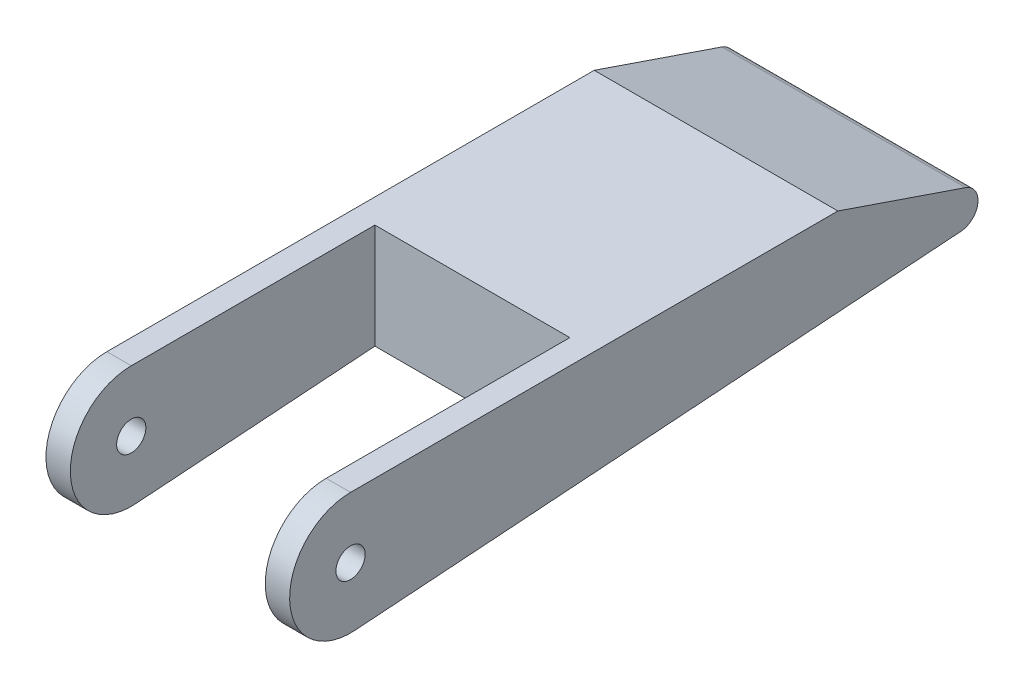
ISO-10303-21;
HEADER;
FILE_DESCRIPTION(('STEP AP214'),'2;1');
FILE_NAME('part.step','',(''),(''),'','','');
FILE_SCHEMA(('AUTOMOTIVE_DESIGN { 1 0 10303 214 1 1 1 1 }'));
ENDSEC;
DATA;
#1=APPLICATION_CONTEXT('core data for automotive mechanical design processes');
#2=APPLICATION_PROTOCOL_DEFINITION('international standard','automotive_design',2000,#1);
#3=PRODUCT_CONTEXT('',#1,'mechanical');
#4=PRODUCT('Part','Part','',(#3));
#5=PRODUCT_RELATED_PRODUCT_CATEGORY('part','',(#4));
#6=PRODUCT_DEFINITION_FORMATION('','',#4);
#7=PRODUCT_DEFINITION_CONTEXT('part definition',#1,'design');
#8=PRODUCT_DEFINITION('design','',#6,#7);
#9=PRODUCT_DEFINITION_SHAPE('','',#8);
#10=(LENGTH_UNIT() NAMED_UNIT(*) SI_UNIT(.MILLI.,.METRE.));
#11=(NAMED_UNIT(*) PLANE_ANGLE_UNIT() SI_UNIT($,.RADIAN.));
#12=(NAMED_UNIT(*) SI_UNIT($,.STERADIAN.) SOLID_ANGLE_UNIT());
#13=UNCERTAINTY_MEASURE_WITH_UNIT(LENGTH_MEASURE(1.E-05),#10,'distance_accuracy_value','');
#14=(GEOMETRIC_REPRESENTATION_CONTEXT(3) GLOBAL_UNCERTAINTY_ASSIGNED_CONTEXT((#13)) GLOBAL_UNIT_ASSIGNED_CONTEXT((#10,
#11,#12)) REPRESENTATION_CONTEXT('',''));
#15=CARTESIAN_POINT('',(0.,0.,0.));
#16=DIRECTION('',(0.,0.,1.));
#17=DIRECTION('',(1.,0.,0.));
#18=AXIS2_PLACEMENT_3D('',#15,#16,#17);
#19=CARTESIAN_POINT('',(20.,0.,0.));
#20=DIRECTION('',(-1.,0.,0.));
#21=DIRECTION('',(0.,0.,1.));
#22=AXIS2_PLACEMENT_3D('',#19,#20,#21);
#23=CYLINDRICAL_SURFACE('',#22,10.);
#24=DIRECTION('',(-1.,0.,0.));
#25=VECTOR('',#24,1.);
#26=CARTESIAN_POINT('',(20.,-9.97546991374341,-0.7));
#27=LINE('',#26,#25);
#28=CARTESIAN_POINT('',(-16.,-9.97546991374341,-0.700000000000006));
#29=VERTEX_POINT('',#28);
#30=CARTESIAN_POINT('',(-20.,-9.97546991374341,-0.7));
#31=VERTEX_POINT('',#30);
#32=EDGE_CURVE('E662',#29,#31,#27,.T.);
#33=ORIENTED_EDGE('',*,*,#32,.F.);
#34=CARTESIAN_POINT('',(-16.,0.,0.));
#35=DIRECTION('',(-1.,0.,0.));
#36=DIRECTION('',(0.,0.,1.));
#37=AXIS2_PLACEMENT_3D('',#34,#35,#36);
#38=CIRCLE('',#37,10.);
#39=CARTESIAN_POINT('',(-16.,10.,0.));
#40=VERTEX_POINT('',#39);
#41=EDGE_CURVE('E764',#29,#40,#38,.T.);
#42=ORIENTED_EDGE('',*,*,#41,.T.);
#43=DIRECTION('',(-1.,0.,0.));
#44=VECTOR('',#43,1.);
#45=CARTESIAN_POINT('',(20.,10.,0.));
#46=LINE('',#45,#44);
#47=CARTESIAN_POINT('',(-20.,10.,0.));
#48=VERTEX_POINT('',#47);
#49=EDGE_CURVE('E703',#40,#48,#46,.T.);
#50=ORIENTED_EDGE('',*,*,#49,.T.);
#51=CARTESIAN_POINT('',(-20.,0.,0.));
#52=DIRECTION('',(1.,0.,0.));
#53=DIRECTION('',(0.,0.,-1.));
#54=AXIS2_PLACEMENT_3D('',#51,#52,#53);
#55=CIRCLE('',#54,10.);
#56=EDGE_CURVE('E745',#48,#31,#55,.T.);
#57=ORIENTED_EDGE('',*,*,#56,.T.);
#58=EDGE_LOOP('',(#33,#42,#50,#57));
#59=FACE_BOUND('',#58,.T.);
#60=ADVANCED_FACE('F655',(#59),#23,.T.);
#61=CARTESIAN_POINT('',(20.,10.,0.));
#62=DIRECTION('',(0.,-1.,0.));
#63=DIRECTION('',(0.,0.,-1.));
#64=AXIS2_PLACEMENT_3D('',#61,#62,#63);
#65=PLANE('',#64);
#66=DIRECTION('',(0.,0.,-1.));
#67=VECTOR('',#66,1.);
#68=CARTESIAN_POINT('',(16.,10.,-40.));
#69=LINE('',#68,#67);
#70=CARTESIAN_POINT('',(16.,10.,0.));
#71=VERTEX_POINT('',#70);
#72=CARTESIAN_POINT('',(16.,10.,-40.));
#73=VERTEX_POINT('',#72);
#74=EDGE_CURVE('E830',#71,#73,#69,.T.);
#75=ORIENTED_EDGE('',*,*,#74,.F.);
#76=CARTESIAN_POINT('',(20.,10.,0.));
#77=VERTEX_POINT('',#76);
#78=EDGE_CURVE('E754',#77,#71,#46,.T.);
#79=ORIENTED_EDGE('',*,*,#78,.F.);
#80=DIRECTION('',(0.,0.,1.));
#81=VECTOR('',#80,1.);
#82=CARTESIAN_POINT('',(20.,10.,0.));
#83=LINE('',#82,#81);
#84=CARTESIAN_POINT('',(20.,10.,-80.));
#85=VERTEX_POINT('',#84);
#86=EDGE_CURVE('E676',#85,#77,#83,.T.);
#87=ORIENTED_EDGE('',*,*,#86,.F.);
#88=DIRECTION('',(-1.,0.,0.));
#89=VECTOR('',#88,1.);
#90=CARTESIAN_POINT('',(20.,10.,-80.));
#91=LINE('',#90,#89);
#92=CARTESIAN_POINT('',(-20.,10.,-80.));
#93=VERTEX_POINT('',#92);
#94=EDGE_CURVE('E733',#85,#93,#91,.T.);
#95=ORIENTED_EDGE('',*,*,#94,.T.);
#96=DIRECTION('',(0.,0.,1.));
#97=VECTOR('',#96,1.);
#98=CARTESIAN_POINT('',(-20.,10.,0.));
#99=LINE('',#98,#97);
#100=EDGE_CURVE('E753',#93,#48,#99,.T.);
#101=ORIENTED_EDGE('',*,*,#100,.T.);
#102=ORIENTED_EDGE('',*,*,#49,.F.);
#103=DIRECTION('',(0.,0.,1.));
#104=VECTOR('',#103,1.);
#105=CARTESIAN_POINT('',(-16.,10.,-40.));
#106=LINE('',#105,#104);
#107=CARTESIAN_POINT('',(-16.,10.,-40.));
#108=VERTEX_POINT('',#107);
#109=EDGE_CURVE('E771',#108,#40,#106,.T.);
#110=ORIENTED_EDGE('',*,*,#109,.F.);
#111=DIRECTION('',(-1.,0.,0.));
#112=VECTOR('',#111,1.);
#113=CARTESIAN_POINT('',(-16.,10.,-40.));
#114=LINE('',#113,#112);
#115=EDGE_CURVE('E818',#73,#108,#114,.T.);
#116=ORIENTED_EDGE('',*,*,#115,.F.);
#117=EDGE_LOOP('',(#75,#79,#87,#95,#101,#102,#110,#116));
#118=FACE_BOUND('',#117,.T.);
#119=ADVANCED_FACE('F817',(#118),#65,.F.);
#120=CARTESIAN_POINT('',(20.,0.,0.));
#121=DIRECTION('',(-1.,0.,0.));
#122=DIRECTION('',(0.,0.,1.));
#123=AXIS2_PLACEMENT_3D('',#120,#121,#122);
#124=CYLINDRICAL_SURFACE('',#123,2.4);
#125=CARTESIAN_POINT('',(16.,0.,0.));
#126=DIRECTION('',(1.,0.,0.));
#127=DIRECTION('',(0.,0.,-1.));
#128=AXIS2_PLACEMENT_3D('',#125,#126,#127);
#129=CIRCLE('',#128,2.4);
#130=CARTESIAN_POINT('',(16.,0.,-2.4));
#131=VERTEX_POINT('',#130);
#132=EDGE_CURVE('E656',#131,#131,#129,.T.);
#133=ORIENTED_EDGE('',*,*,#132,.F.);
#134=EDGE_LOOP('',(#133));
#135=FACE_BOUND('',#134,.T.);
#136=CARTESIAN_POINT('',(20.,0.,0.));
#137=DIRECTION('',(1.,0.,0.));
#138=DIRECTION('',(0.,0.,-1.));
#139=AXIS2_PLACEMENT_3D('',#136,#137,#138);
#140=CIRCLE('',#139,2.4);
#141=CARTESIAN_POINT('',(20.,0.,-2.4));
#142=VERTEX_POINT('',#141);
#143=EDGE_CURVE('E748',#142,#142,#140,.T.);
#144=ORIENTED_EDGE('',*,*,#143,.T.);
#145=EDGE_LOOP('',(#144));
#146=FACE_BOUND('',#145,.T.);
#147=ADVANCED_FACE('F846',(#135,#146),#124,.F.);
#148=CARTESIAN_POINT('',(20.,0.,0.));
#149=DIRECTION('',(1.,0.,0.));
#150=DIRECTION('',(0.,0.,-1.));
#151=AXIS2_PLACEMENT_3D('',#148,#149,#150);
#152=PLANE('',#151);
#153=CARTESIAN_POINT('',(20.,0.,0.));
#154=DIRECTION('',(1.,0.,0.));
#155=DIRECTION('',(0.,0.,-1.));
#156=AXIS2_PLACEMENT_3D('',#153,#154,#155);
#157=CIRCLE('',#156,10.);
#158=CARTESIAN_POINT('',(20.,-9.97546991374341,-0.7));
#159=VERTEX_POINT('',#158);
#160=EDGE_CURVE('E751',#77,#159,#157,.T.);
#161=ORIENTED_EDGE('',*,*,#160,.T.);
#162=DIRECTION('',(0.,0.07,-0.997546991374341));
#163=VECTOR('',#162,1.);
#164=CARTESIAN_POINT('',(20.,-4.41081977896402,-80.));
#165=LINE('',#164,#163);
#166=CARTESIAN_POINT('',(20.,-2.99264097412302,-100.21));
#167=VERTEX_POINT('',#166);
#168=EDGE_CURVE('E711',#159,#167,#165,.T.);
#169=ORIENTED_EDGE('',*,*,#168,.T.);
#170=CARTESIAN_POINT('',(20.,0.,-100.));
#171=DIRECTION('',(1.,0.,0.));
#172=DIRECTION('',(0.,0.,1.));
#173=AXIS2_PLACEMENT_3D('',#170,#171,#172);
#174=CIRCLE('',#173,2.99999999999999);
#175=CARTESIAN_POINT('',(20.,2.83902237673923,-100.96951118837));
#176=VERTEX_POINT('',#175);
#177=EDGE_CURVE('E720',#167,#176,#174,.T.);
#178=ORIENTED_EDGE('',*,*,#177,.T.);
#179=DIRECTION('',(0.,0.323170396123207,0.946340792246413));
#180=VECTOR('',#179,1.);
#181=CARTESIAN_POINT('',(20.,10.,-80.));
#182=LINE('',#181,#180);
#183=EDGE_CURVE('E721',#176,#85,#182,.T.);
#184=ORIENTED_EDGE('',*,*,#183,.T.);
#185=ORIENTED_EDGE('',*,*,#86,.T.);
#186=EDGE_LOOP('',(#161,#169,#178,#184,#185));
#187=FACE_BOUND('',#186,.T.);
#188=ORIENTED_EDGE('',*,*,#143,.F.);
#189=EDGE_LOOP('',(#188));
#190=FACE_BOUND('',#189,.T.);
#191=ADVANCED_FACE('F716',(#187,#190),#152,.T.);
#192=CARTESIAN_POINT('',(-20.,0.,0.));
#193=DIRECTION('',(1.,0.,0.));
#194=DIRECTION('',(0.,0.,-1.));
#195=AXIS2_PLACEMENT_3D('',#192,#193,#194);
#196=PLANE('',#195);
#197=ORIENTED_EDGE('',*,*,#56,.F.);
#198=ORIENTED_EDGE('',*,*,#100,.F.);
#199=DIRECTION('',(0.,0.323170396123207,0.946340792246413));
#200=VECTOR('',#199,1.);
#201=CARTESIAN_POINT('',(-20.,10.,-80.));
#202=LINE('',#201,#200);
#203=CARTESIAN_POINT('',(-20.,2.83902237673923,-100.96951118837));
#204=VERTEX_POINT('',#203);
#205=EDGE_CURVE('E750',#204,#93,#202,.T.);
#206=ORIENTED_EDGE('',*,*,#205,.F.);
#207=CARTESIAN_POINT('',(-20.,0.,-100.));
#208=DIRECTION('',(1.,0.,0.));
#209=DIRECTION('',(0.,0.,1.));
#210=AXIS2_PLACEMENT_3D('',#207,#208,#209);
#211=CIRCLE('',#210,2.99999999999999);
#212=CARTESIAN_POINT('',(-20.,-2.99264097412302,-100.21));
#213=VERTEX_POINT('',#212);
#214=EDGE_CURVE('E732',#213,#204,#211,.T.);
#215=ORIENTED_EDGE('',*,*,#214,.F.);
#216=DIRECTION('',(0.,0.07,-0.997546991374341));
#217=VECTOR('',#216,1.);
#218=CARTESIAN_POINT('',(-20.,-2.99264097412302,-100.21));
#219=LINE('',#218,#217);
#220=EDGE_CURVE('E742',#31,#213,#219,.T.);
#221=ORIENTED_EDGE('',*,*,#220,.F.);
#222=EDGE_LOOP('',(#197,#198,#206,#215,#221));
#223=FACE_BOUND('',#222,.T.);
#224=CARTESIAN_POINT('',(-20.,0.,0.));
#225=DIRECTION('',(1.,0.,0.));
#226=DIRECTION('',(0.,0.,-1.));
#227=AXIS2_PLACEMENT_3D('',#224,#225,#226);
#228=CIRCLE('',#227,2.4);
#229=CARTESIAN_POINT('',(-20.,0.,-2.4));
#230=VERTEX_POINT('',#229);
#231=EDGE_CURVE('E789',#230,#230,#228,.T.);
#232=ORIENTED_EDGE('',*,*,#231,.T.);
#233=EDGE_LOOP('',(#232));
#234=FACE_BOUND('',#233,.T.);
#235=ADVANCED_FACE('F823',(#223,#234),#196,.F.);
#236=ORIENTED_EDGE('',*,*,#78,.T.);
#237=CARTESIAN_POINT('',(16.,0.,0.));
#238=DIRECTION('',(1.,0.,0.));
#239=DIRECTION('',(0.,0.,-1.));
#240=AXIS2_PLACEMENT_3D('',#237,#238,#239);
#241=CIRCLE('',#240,10.);
#242=CARTESIAN_POINT('',(16.,-9.97546991374341,-0.700000000000006));
#243=VERTEX_POINT('',#242);
#244=EDGE_CURVE('E785',#71,#243,#241,.T.);
#245=ORIENTED_EDGE('',*,*,#244,.T.);
#246=EDGE_CURVE('E12',#159,#243,#27,.T.);
#247=ORIENTED_EDGE('',*,*,#246,.F.);
#248=ORIENTED_EDGE('',*,*,#160,.F.);
#249=EDGE_LOOP('',(#236,#245,#247,#248));
#250=FACE_BOUND('',#249,.T.);
#251=ADVANCED_FACE('F652',(#250),#23,.T.);
#252=CARTESIAN_POINT('',(20.,-2.99264097412302,-100.21));
#253=DIRECTION('',(0.,0.997546991374341,0.07));
#254=DIRECTION('',(0.,-0.07,0.997546991374341));
#255=AXIS2_PLACEMENT_3D('',#252,#253,#254);
#256=PLANE('',#255);
#257=ORIENTED_EDGE('',*,*,#246,.T.);
#258=DIRECTION('',(0.,0.07,-0.997546991374341));
#259=VECTOR('',#258,1.);
#260=CARTESIAN_POINT('',(16.,-2.99264097412302,-100.21));
#261=LINE('',#260,#259);
#262=CARTESIAN_POINT('',(16.,-7.21770509285022,-40.));
#263=VERTEX_POINT('',#262);
#264=EDGE_CURVE('E777',#243,#263,#261,.T.);
#265=ORIENTED_EDGE('',*,*,#264,.T.);
#266=DIRECTION('',(-1.,0.,0.));
#267=VECTOR('',#266,1.);
#268=CARTESIAN_POINT('',(20.,-7.21770509285022,-40.));
#269=LINE('',#268,#267);
#270=CARTESIAN_POINT('',(-16.,-7.21770509285022,-40.));
#271=VERTEX_POINT('',#270);
#272=EDGE_CURVE('E787',#263,#271,#269,.T.);
#273=ORIENTED_EDGE('',*,*,#272,.T.);
#274=DIRECTION('',(0.,-0.07,0.997546991374341));
#275=VECTOR('',#274,1.);
#276=CARTESIAN_POINT('',(-16.,-2.99264097412302,-100.21));
#277=LINE('',#276,#275);
#278=EDGE_CURVE('E759',#271,#29,#277,.T.);
#279=ORIENTED_EDGE('',*,*,#278,.T.);
#280=ORIENTED_EDGE('',*,*,#32,.T.);
#281=ORIENTED_EDGE('',*,*,#220,.T.);
#282=DIRECTION('',(-1.,0.,0.));
#283=VECTOR('',#282,1.);
#284=CARTESIAN_POINT('',(20.,-2.99264097412302,-100.21));
#285=LINE('',#284,#283);
#286=EDGE_CURVE('E734',#167,#213,#285,.T.);
#287=ORIENTED_EDGE('',*,*,#286,.F.);
#288=ORIENTED_EDGE('',*,*,#168,.F.);
#289=EDGE_LOOP('',(#257,#265,#273,#279,#280,#281,#287,#288));
#290=FACE_BOUND('',#289,.T.);
#291=ADVANCED_FACE('F798',(#290),#256,.F.);
#292=CARTESIAN_POINT('',(20.,0.,-100.));
#293=DIRECTION('',(-1.,0.,0.));
#294=DIRECTION('',(0.,0.,1.));
#295=AXIS2_PLACEMENT_3D('',#292,#293,#294);
#296=CYLINDRICAL_SURFACE('',#295,2.99999999999999);
#297=ORIENTED_EDGE('',*,*,#214,.T.);
#298=DIRECTION('',(-1.,0.,0.));
#299=VECTOR('',#298,1.);
#300=CARTESIAN_POINT('',(20.,2.83902237673923,-100.96951118837));
#301=LINE('',#300,#299);
#302=EDGE_CURVE('E730',#176,#204,#301,.T.);
#303=ORIENTED_EDGE('',*,*,#302,.F.);
#304=ORIENTED_EDGE('',*,*,#177,.F.);
#305=ORIENTED_EDGE('',*,*,#286,.T.);
#306=EDGE_LOOP('',(#297,#303,#304,#305));
#307=FACE_BOUND('',#306,.T.);
#308=ADVANCED_FACE('F728',(#307),#296,.T.);
#309=CARTESIAN_POINT('',(20.,10.,-80.));
#310=DIRECTION('',(0.,-0.946340792246413,0.323170396123207));
#311=DIRECTION('',(0.,-0.323170396123207,-0.946340792246414));
#312=AXIS2_PLACEMENT_3D('',#309,#310,#311);
#313=PLANE('',#312);
#314=ORIENTED_EDGE('',*,*,#205,.T.);
#315=ORIENTED_EDGE('',*,*,#94,.F.);
#316=ORIENTED_EDGE('',*,*,#183,.F.);
#317=ORIENTED_EDGE('',*,*,#302,.T.);
#318=EDGE_LOOP('',(#314,#315,#316,#317));
#319=FACE_BOUND('',#318,.T.);
#320=ADVANCED_FACE('F736',(#319),#313,.F.);
#321=CARTESIAN_POINT('',(-16.,0.,0.));
#322=DIRECTION('',(-1.,0.,0.));
#323=DIRECTION('',(0.,0.,1.));
#324=AXIS2_PLACEMENT_3D('',#321,#322,#323);
#325=CIRCLE('',#324,2.4);
#326=CARTESIAN_POINT('',(-16.,0.,2.4));
#327=VERTEX_POINT('',#326);
#328=EDGE_CURVE('E758',#327,#327,#325,.T.);
#329=ORIENTED_EDGE('',*,*,#328,.F.);
#330=EDGE_LOOP('',(#329));
#331=FACE_BOUND('',#330,.T.);
#332=ORIENTED_EDGE('',*,*,#231,.F.);
#333=EDGE_LOOP('',(#332));
#334=FACE_BOUND('',#333,.T.);
#335=ADVANCED_FACE('F840',(#331,#334),#124,.F.);
#336=CARTESIAN_POINT('',(-16.,-10.,-40.));
#337=DIRECTION('',(0.,0.,-1.));
#338=DIRECTION('',(-1.,0.,0.));
#339=AXIS2_PLACEMENT_3D('',#336,#337,#338);
#340=PLANE('',#339);
#341=DIRECTION('',(0.,1.,0.));
#342=VECTOR('',#341,1.);
#343=CARTESIAN_POINT('',(16.,-10.,-40.));
#344=LINE('',#343,#342);
#345=EDGE_CURVE('E668',#263,#73,#344,.T.);
#346=ORIENTED_EDGE('',*,*,#345,.T.);
#347=ORIENTED_EDGE('',*,*,#115,.T.);
#348=DIRECTION('',(0.,1.,0.));
#349=VECTOR('',#348,1.);
#350=CARTESIAN_POINT('',(-16.,-10.,-40.));
#351=LINE('',#350,#349);
#352=EDGE_CURVE('E761',#271,#108,#351,.T.);
#353=ORIENTED_EDGE('',*,*,#352,.F.);
#354=ORIENTED_EDGE('',*,*,#272,.F.);
#355=EDGE_LOOP('',(#346,#347,#353,#354));
#356=FACE_BOUND('',#355,.T.);
#357=ADVANCED_FACE('F827',(#356),#340,.F.);
#358=CARTESIAN_POINT('',(16.,-10.,-40.));
#359=DIRECTION('',(1.,0.,0.));
#360=DIRECTION('',(0.,0.,-1.));
#361=AXIS2_PLACEMENT_3D('',#358,#359,#360);
#362=PLANE('',#361);
#363=ORIENTED_EDGE('',*,*,#132,.T.);
#364=EDGE_LOOP('',(#363));
#365=FACE_BOUND('',#364,.T.);
#366=ORIENTED_EDGE('',*,*,#74,.T.);
#367=ORIENTED_EDGE('',*,*,#345,.F.);
#368=ORIENTED_EDGE('',*,*,#264,.F.);
#369=ORIENTED_EDGE('',*,*,#244,.F.);
#370=EDGE_LOOP('',(#366,#367,#368,#369));
#371=FACE_BOUND('',#370,.T.);
#372=ADVANCED_FACE('F826',(#365,#371),#362,.F.);
#373=CARTESIAN_POINT('',(-16.,-10.,-40.));
#374=DIRECTION('',(-1.,0.,0.));
#375=DIRECTION('',(0.,0.,1.));
#376=AXIS2_PLACEMENT_3D('',#373,#374,#375);
#377=PLANE('',#376);
#378=ORIENTED_EDGE('',*,*,#328,.T.);
#379=EDGE_LOOP('',(#378));
#380=FACE_BOUND('',#379,.T.);
#381=ORIENTED_EDGE('',*,*,#41,.F.);
#382=ORIENTED_EDGE('',*,*,#278,.F.);
#383=ORIENTED_EDGE('',*,*,#352,.T.);
#384=ORIENTED_EDGE('',*,*,#109,.T.);
#385=EDGE_LOOP('',(#381,#382,#383,#384));
#386=FACE_BOUND('',#385,.T.);
#387=ADVANCED_FACE('F814',(#380,#386),#377,.F.);
#388=CLOSED_SHELL('',(#60,#119,#147,#191,#235,#251,#291,#308,#320,#335,#357,#372,#387));
#389=MANIFOLD_SOLID_BREP('B2',#388);
#390=ADVANCED_BREP_SHAPE_REPRESENTATION('',(#18,#389),#14);
#391=SHAPE_DEFINITION_REPRESENTATION(#9,#390);
ENDSEC;
END-ISO-10303-21;
